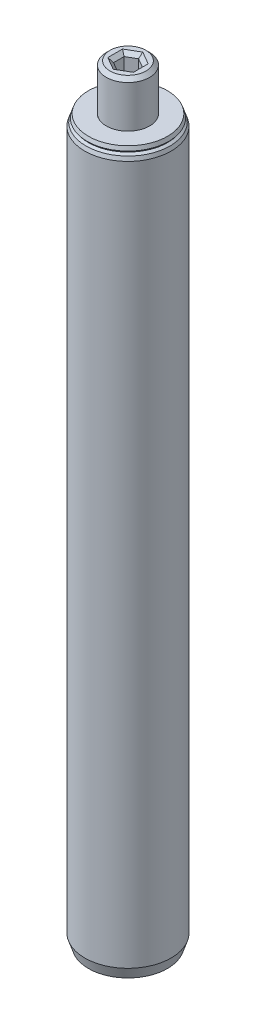
ISO-10303-21;
HEADER;
FILE_DESCRIPTION(('STEP AP214'),'2;1');
FILE_NAME('part.step','',(''),(''),'','','');
FILE_SCHEMA(('AUTOMOTIVE_DESIGN { 1 0 10303 214 1 1 1 1 }'));
ENDSEC;
DATA;
#1=APPLICATION_CONTEXT('core data for automotive mechanical design processes');
#2=APPLICATION_PROTOCOL_DEFINITION('international standard','automotive_design',2000,#1);
#3=PRODUCT_CONTEXT('',#1,'mechanical');
#4=PRODUCT('Part','Part','',(#3));
#5=PRODUCT_RELATED_PRODUCT_CATEGORY('part','',(#4));
#6=PRODUCT_DEFINITION_FORMATION('','',#4);
#7=PRODUCT_DEFINITION_CONTEXT('part definition',#1,'design');
#8=PRODUCT_DEFINITION('design','',#6,#7);
#9=PRODUCT_DEFINITION_SHAPE('','',#8);
#10=(LENGTH_UNIT() NAMED_UNIT(*) SI_UNIT(.MILLI.,.METRE.));
#11=(NAMED_UNIT(*) PLANE_ANGLE_UNIT() SI_UNIT($,.RADIAN.));
#12=(NAMED_UNIT(*) SI_UNIT($,.STERADIAN.) SOLID_ANGLE_UNIT());
#13=UNCERTAINTY_MEASURE_WITH_UNIT(LENGTH_MEASURE(1.E-05),#10,'distance_accuracy_value','');
#14=(GEOMETRIC_REPRESENTATION_CONTEXT(3) GLOBAL_UNCERTAINTY_ASSIGNED_CONTEXT((#13)) GLOBAL_UNIT_ASSIGNED_CONTEXT((#10,
#11,#12)) REPRESENTATION_CONTEXT('',''));
#15=CARTESIAN_POINT('',(0.,0.,0.));
#16=DIRECTION('',(0.,0.,1.));
#17=DIRECTION('',(1.,0.,0.));
#18=AXIS2_PLACEMENT_3D('',#15,#16,#17);
#19=CARTESIAN_POINT('',(0.,50.0126,0.));
#20=DIRECTION('',(0.,-1.,0.));
#21=DIRECTION('',(0.,0.,-1.));
#22=AXIS2_PLACEMENT_3D('',#19,#20,#21);
#23=PLANE('',#22);
#24=CARTESIAN_POINT('',(0.,50.0126,0.));
#25=DIRECTION('',(0.,-1.,0.));
#26=DIRECTION('',(0.,0.,-1.));
#27=AXIS2_PLACEMENT_3D('',#24,#25,#26);
#28=CIRCLE('',#27,1.50399999999999);
#29=CARTESIAN_POINT('',(0.,50.0126,-1.50399999999999));
#30=VERTEX_POINT('',#29);
#31=EDGE_CURVE('P0_E11',#30,#30,#28,.T.);
#32=ORIENTED_EDGE('',*,*,#31,.T.);
#33=EDGE_LOOP('',(#32));
#34=FACE_BOUND('',#33,.T.);
#35=CARTESIAN_POINT('',(0.,50.0126,0.));
#36=DIRECTION('',(0.,1.,0.));
#37=DIRECTION('',(0.,0.,1.));
#38=AXIS2_PLACEMENT_3D('',#35,#36,#37);
#39=CIRCLE('',#38,2.74319999999998);
#40=CARTESIAN_POINT('',(0.,50.0126,2.74319999999998));
#41=VERTEX_POINT('',#40);
#42=EDGE_CURVE('P0_E63',#41,#41,#39,.T.);
#43=ORIENTED_EDGE('',*,*,#42,.T.);
#44=EDGE_LOOP('',(#43));
#45=FACE_BOUND('',#44,.T.);
#46=ADVANCED_FACE('P0_F16',(#34,#45),#23,.F.);
#47=CARTESIAN_POINT('',(0.,49.7520827788524,0.));
#48=DIRECTION('',(0.,-1.,0.));
#49=DIRECTION('',(0.,0.,-1.));
#50=AXIS2_PLACEMENT_3D('',#47,#48,#49);
#51=CONICAL_SURFACE('',#50,2.83003907371584,0.321750554396634);
#52=ORIENTED_EDGE('',*,*,#42,.F.);
#53=EDGE_LOOP('',(#52));
#54=FACE_BOUND('',#53,.T.);
#55=CARTESIAN_POINT('',(0.,49.7520827788524,0.));
#56=DIRECTION('',(0.,1.,0.));
#57=DIRECTION('',(0.,0.,1.));
#58=AXIS2_PLACEMENT_3D('',#55,#56,#57);
#59=CIRCLE('',#58,2.83003907371584);
#60=CARTESIAN_POINT('',(0.,49.7520827788524,2.83003907371584));
#61=VERTEX_POINT('',#60);
#62=EDGE_CURVE('P0_E60',#61,#61,#59,.T.);
#63=ORIENTED_EDGE('',*,*,#62,.T.);
#64=EDGE_LOOP('',(#63));
#65=FACE_BOUND('',#64,.T.);
#66=ADVANCED_FACE('P0_F84',(#54,#65),#51,.T.);
#67=CARTESIAN_POINT('',(0.,49.6316,0.));
#68=DIRECTION('',(0.,1.,0.));
#69=DIRECTION('',(0.,0.,1.));
#70=AXIS2_PLACEMENT_3D('',#67,#68,#69);
#71=CONICAL_SURFACE('',#70,2.74319999999998,0.624522886199129);
#72=ORIENTED_EDGE('',*,*,#62,.F.);
#73=EDGE_LOOP('',(#72));
#74=FACE_BOUND('',#73,.T.);
#75=CARTESIAN_POINT('',(0.,49.6316,0.));
#76=DIRECTION('',(0.,1.,0.));
#77=DIRECTION('',(0.,0.,1.));
#78=AXIS2_PLACEMENT_3D('',#75,#76,#77);
#79=CIRCLE('',#78,2.74319999999998);
#80=CARTESIAN_POINT('',(0.,49.6316,2.74319999999998));
#81=VERTEX_POINT('',#80);
#82=EDGE_CURVE('P0_E57',#81,#81,#79,.T.);
#83=ORIENTED_EDGE('',*,*,#82,.T.);
#84=EDGE_LOOP('',(#83));
#85=FACE_BOUND('',#84,.T.);
#86=ADVANCED_FACE('P0_F90',(#74,#85),#71,.T.);
#87=CARTESIAN_POINT('',(0.,49.5111172211476,0.));
#88=DIRECTION('',(0.,-1.,0.));
#89=DIRECTION('',(0.,0.,-1.));
#90=AXIS2_PLACEMENT_3D('',#87,#88,#89);
#91=CONICAL_SURFACE('',#90,2.91036092628412,0.946273440595771);
#92=ORIENTED_EDGE('',*,*,#82,.F.);
#93=EDGE_LOOP('',(#92));
#94=FACE_BOUND('',#93,.T.);
#95=CARTESIAN_POINT('',(0.,49.5111172211476,0.));
#96=DIRECTION('',(0.,1.,0.));
#97=DIRECTION('',(0.,0.,1.));
#98=AXIS2_PLACEMENT_3D('',#95,#96,#97);
#99=CIRCLE('',#98,2.91036092628412);
#100=CARTESIAN_POINT('',(0.,49.5111172211476,2.91036092628412));
#101=VERTEX_POINT('',#100);
#102=EDGE_CURVE('P0_E54',#101,#101,#99,.T.);
#103=ORIENTED_EDGE('',*,*,#102,.T.);
#104=EDGE_LOOP('',(#103));
#105=FACE_BOUND('',#104,.T.);
#106=ADVANCED_FACE('P0_F97',(#94,#105),#91,.T.);
#107=CARTESIAN_POINT('',(0.,49.2506,0.));
#108=DIRECTION('',(0.,-1.,0.));
#109=DIRECTION('',(0.,0.,-1.));
#110=AXIS2_PLACEMENT_3D('',#107,#108,#109);
#111=CONICAL_SURFACE('',#110,2.99719999999998,0.321750554396655);
#112=ORIENTED_EDGE('',*,*,#102,.F.);
#113=EDGE_LOOP('',(#112));
#114=FACE_BOUND('',#113,.T.);
#115=CARTESIAN_POINT('',(0.,49.2506,0.));
#116=DIRECTION('',(0.,1.,0.));
#117=DIRECTION('',(0.,0.,1.));
#118=AXIS2_PLACEMENT_3D('',#115,#116,#117);
#119=CIRCLE('',#118,2.99719999999998);
#120=CARTESIAN_POINT('',(0.,49.2506,2.99719999999998));
#121=VERTEX_POINT('',#120);
#122=EDGE_CURVE('P0_E51',#121,#121,#119,.T.);
#123=ORIENTED_EDGE('',*,*,#122,.T.);
#124=EDGE_LOOP('',(#123));
#125=FACE_BOUND('',#124,.T.);
#126=ADVANCED_FACE('P0_F101',(#114,#125),#111,.T.);
#127=CARTESIAN_POINT('',(0.,50.0126,0.));
#128=DIRECTION('',(0.,1.,0.));
#129=DIRECTION('',(0.,0.,1.));
#130=AXIS2_PLACEMENT_3D('',#127,#128,#129);
#131=CYLINDRICAL_SURFACE('',#130,2.99719999999998);
#132=ORIENTED_EDGE('',*,*,#122,.F.);
#133=EDGE_LOOP('',(#132));
#134=FACE_BOUND('',#133,.T.);
#135=CARTESIAN_POINT('',(0.,0.761999999999999,0.));
#136=DIRECTION('',(0.,1.,0.));
#137=DIRECTION('',(0.,0.,1.));
#138=AXIS2_PLACEMENT_3D('',#135,#136,#137);
#139=CIRCLE('',#138,2.99719999999998);
#140=CARTESIAN_POINT('',(0.,0.761999999999999,2.99719999999998));
#141=VERTEX_POINT('',#140);
#142=EDGE_CURVE('P0_E48',#141,#141,#139,.T.);
#143=ORIENTED_EDGE('',*,*,#142,.T.);
#144=EDGE_LOOP('',(#143));
#145=FACE_BOUND('',#144,.T.);
#146=ADVANCED_FACE('P0_F105',(#134,#145),#131,.T.);
#147=CARTESIAN_POINT('',(0.,0.,0.));
#148=DIRECTION('',(0.,1.,0.));
#149=DIRECTION('',(0.,0.,1.));
#150=AXIS2_PLACEMENT_3D('',#147,#148,#149);
#151=CONICAL_SURFACE('',#150,2.74319999999998,0.321750554396644);
#152=ORIENTED_EDGE('',*,*,#142,.F.);
#153=EDGE_LOOP('',(#152));
#154=FACE_BOUND('',#153,.T.);
#155=CARTESIAN_POINT('',(0.,0.,0.));
#156=DIRECTION('',(0.,1.,0.));
#157=DIRECTION('',(0.,0.,1.));
#158=AXIS2_PLACEMENT_3D('',#155,#156,#157);
#159=CIRCLE('',#158,2.74319999999998);
#160=CARTESIAN_POINT('',(0.,0.,2.74319999999998));
#161=VERTEX_POINT('',#160);
#162=EDGE_CURVE('P0_E43',#161,#161,#159,.T.);
#163=ORIENTED_EDGE('',*,*,#162,.T.);
#164=EDGE_LOOP('',(#163));
#165=FACE_BOUND('',#164,.T.);
#166=ADVANCED_FACE('P0_F109',(#154,#165),#151,.T.);
#167=CARTESIAN_POINT('',(2.74319999999998,0.,0.));
#168=DIRECTION('',(0.,1.,0.));
#169=DIRECTION('',(0.,0.,1.));
#170=AXIS2_PLACEMENT_3D('',#167,#168,#169);
#171=PLANE('',#170);
#172=CARTESIAN_POINT('',(0.,0.,0.));
#173=DIRECTION('',(0.,1.,0.));
#174=DIRECTION('',(0.,0.,1.));
#175=AXIS2_PLACEMENT_3D('',#172,#173,#174);
#176=CIRCLE('',#175,1.50399999999999);
#177=CARTESIAN_POINT('',(0.,0.,1.50399999999999));
#178=VERTEX_POINT('',#177);
#179=EDGE_CURVE('P0_E69',#178,#178,#176,.T.);
#180=ORIENTED_EDGE('',*,*,#179,.T.);
#181=EDGE_LOOP('',(#180));
#182=FACE_BOUND('',#181,.T.);
#183=ORIENTED_EDGE('',*,*,#162,.F.);
#184=EDGE_LOOP('',(#183));
#185=FACE_BOUND('',#184,.T.);
#186=ADVANCED_FACE('P0_F113',(#182,#185),#171,.F.);
#187=CARTESIAN_POINT('',(0.,0.,0.));
#188=DIRECTION('',(0.,-1.,0.));
#189=DIRECTION('',(0.,0.,-1.));
#190=AXIS2_PLACEMENT_3D('',#187,#188,#189);
#191=CYLINDRICAL_SURFACE('',#190,1.25);
#192=CARTESIAN_POINT('',(0.,0.439940905122491,0.));
#193=DIRECTION('',(0.,1.,0.));
#194=DIRECTION('',(0.,0.,1.));
#195=AXIS2_PLACEMENT_3D('',#192,#193,#194);
#196=CIRCLE('',#195,1.25);
#197=CARTESIAN_POINT('',(0.,0.439940905122491,1.25));
#198=VERTEX_POINT('',#197);
#199=EDGE_CURVE('P0_E66',#198,#198,#196,.F.);
#200=ORIENTED_EDGE('',*,*,#199,.T.);
#201=EDGE_LOOP('',(#200));
#202=FACE_BOUND('',#201,.T.);
#203=CARTESIAN_POINT('',(0.,5.08,0.));
#204=DIRECTION('',(0.,-1.,0.));
#205=DIRECTION('',(0.,0.,-1.));
#206=AXIS2_PLACEMENT_3D('',#203,#204,#205);
#207=CIRCLE('',#206,1.25);
#208=CARTESIAN_POINT('',(0.,5.08,-1.25));
#209=VERTEX_POINT('',#208);
#210=EDGE_CURVE('P0_E40',#209,#209,#207,.T.);
#211=ORIENTED_EDGE('',*,*,#210,.F.);
#212=EDGE_LOOP('',(#211));
#213=FACE_BOUND('',#212,.T.);
#214=ADVANCED_FACE('P0_F117',(#202,#213),#191,.F.);
#215=CARTESIAN_POINT('',(0.,5.08,0.));
#216=DIRECTION('',(0.,-1.,0.));
#217=DIRECTION('',(0.,0.,-1.));
#218=AXIS2_PLACEMENT_3D('',#215,#216,#217);
#219=CONICAL_SURFACE('',#218,1.25,1.02974425867665);
#220=CARTESIAN_POINT('',(0.,5.83107577378445,0.));
#221=VERTEX_POINT('',#220);
#222=VERTEX_LOOP('',#221);
#223=FACE_BOUND('',#222,.T.);
#224=ORIENTED_EDGE('',*,*,#210,.T.);
#225=EDGE_LOOP('',(#224));
#226=FACE_BOUND('',#225,.T.);
#227=ADVANCED_FACE('P0_F121',(#223,#226),#219,.F.);
#228=CARTESIAN_POINT('',(0.,50.0126,0.));
#229=DIRECTION('',(0.,1.,0.));
#230=DIRECTION('',(0.,0.,1.));
#231=AXIS2_PLACEMENT_3D('',#228,#229,#230);
#232=CYLINDRICAL_SURFACE('',#231,1.25);
#233=CARTESIAN_POINT('',(0.,49.5726590948775,0.));
#234=DIRECTION('',(0.,-1.,0.));
#235=DIRECTION('',(0.,0.,-1.));
#236=AXIS2_PLACEMENT_3D('',#233,#234,#235);
#237=CIRCLE('',#236,1.25);
#238=CARTESIAN_POINT('',(0.,49.5726590948775,-1.25));
#239=VERTEX_POINT('',#238);
#240=EDGE_CURVE('P0_E24',#239,#239,#237,.F.);
#241=ORIENTED_EDGE('',*,*,#240,.T.);
#242=EDGE_LOOP('',(#241));
#243=FACE_BOUND('',#242,.T.);
#244=CARTESIAN_POINT('',(0.,44.9326,0.));
#245=DIRECTION('',(0.,1.,0.));
#246=DIRECTION('',(0.,0.,1.));
#247=AXIS2_PLACEMENT_3D('',#244,#245,#246);
#248=CIRCLE('',#247,1.25);
#249=CARTESIAN_POINT('',(0.,44.9326,1.25));
#250=VERTEX_POINT('',#249);
#251=EDGE_CURVE('P0_E38',#250,#250,#248,.T.);
#252=ORIENTED_EDGE('',*,*,#251,.F.);
#253=EDGE_LOOP('',(#252));
#254=FACE_BOUND('',#253,.T.);
#255=ADVANCED_FACE('P0_F34',(#243,#254),#232,.F.);
#256=CARTESIAN_POINT('',(0.,44.9326,0.));
#257=DIRECTION('',(0.,1.,0.));
#258=DIRECTION('',(0.,0.,1.));
#259=AXIS2_PLACEMENT_3D('',#256,#257,#258);
#260=CONICAL_SURFACE('',#259,1.25,1.02974425867665);
#261=CARTESIAN_POINT('',(0.,44.1815242262155,0.));
#262=VERTEX_POINT('',#261);
#263=VERTEX_LOOP('',#262);
#264=FACE_BOUND('',#263,.T.);
#265=ORIENTED_EDGE('',*,*,#251,.T.);
#266=EDGE_LOOP('',(#265));
#267=FACE_BOUND('',#266,.T.);
#268=ADVANCED_FACE('P0_F30',(#264,#267),#260,.F.);
#269=CARTESIAN_POINT('',(0.,0.439940905122491,0.));
#270=DIRECTION('',(0.,-1.,0.));
#271=DIRECTION('',(0.,0.,-1.));
#272=AXIS2_PLACEMENT_3D('',#269,#270,#271);
#273=CONICAL_SURFACE('',#272,1.25,0.523598775598296);
#274=ORIENTED_EDGE('',*,*,#179,.F.);
#275=EDGE_LOOP('',(#274));
#276=FACE_BOUND('',#275,.T.);
#277=ORIENTED_EDGE('',*,*,#199,.F.);
#278=EDGE_LOOP('',(#277));
#279=FACE_BOUND('',#278,.T.);
#280=ADVANCED_FACE('P0_F33',(#276,#279),#273,.F.);
#281=CARTESIAN_POINT('',(0.,49.5726590948775,0.));
#282=DIRECTION('',(0.,1.,0.));
#283=DIRECTION('',(0.,0.,1.));
#284=AXIS2_PLACEMENT_3D('',#281,#282,#283);
#285=CONICAL_SURFACE('',#284,1.25,0.523598775598296);
#286=ORIENTED_EDGE('',*,*,#31,.F.);
#287=EDGE_LOOP('',(#286));
#288=FACE_BOUND('',#287,.T.);
#289=ORIENTED_EDGE('',*,*,#240,.F.);
#290=EDGE_LOOP('',(#289));
#291=FACE_BOUND('',#290,.T.);
#292=ADVANCED_FACE('P0_F18',(#288,#291),#285,.F.);
#293=CLOSED_SHELL('',(#46,#66,#86,#106,#126,#146,#166,#186,#214,#227,#255,#268,#280,#292));
#294=MANIFOLD_SOLID_BREP('P0_B1',#293);
#295=CARTESIAN_POINT('',(-1.29903810567666,45.1876,0.749999999999999));
#296=DIRECTION('',(0.,1.,0.));
#297=DIRECTION('',(0.5,0.,0.866025403784439));
#298=AXIS2_PLACEMENT_3D('',#295,#296,#297);
#299=PLANE('',#298);
#300=CARTESIAN_POINT('',(0.,45.1876,0.));
#301=DIRECTION('',(0.,1.,0.));
#302=DIRECTION('',(0.5,0.,0.866025403784439));
#303=AXIS2_PLACEMENT_3D('',#300,#301,#302);
#304=CIRCLE('',#303,1.246);
#305=CARTESIAN_POINT('',(0.623,45.1876,1.07906765311541));
#306=VERTEX_POINT('',#305);
#307=EDGE_CURVE('P1_E125',#306,#306,#304,.F.);
#308=ORIENTED_EDGE('',*,*,#307,.T.);
#309=EDGE_LOOP('',(#308));
#310=FACE_BOUND('',#309,.T.);
#311=ADVANCED_FACE('P1_F15',(#310),#299,.F.);
#312=CARTESIAN_POINT('',(0.,53.1876,0.));
#313=DIRECTION('',(0.,-1.,0.));
#314=DIRECTION('',(-0.5,0.,-0.866025403784439));
#315=AXIS2_PLACEMENT_3D('',#312,#313,#314);
#316=PLANE('',#315);
#317=DIRECTION('',(0.866025403784439,0.,0.5));
#318=VECTOR('',#317,1.);
#319=CARTESIAN_POINT('',(0.444500000000001,53.1876,-0.769896583964367));
#320=LINE('',#319,#318);
#321=CARTESIAN_POINT('',(0.,53.1876,-1.02652877861916));
#322=VERTEX_POINT('',#321);
#323=CARTESIAN_POINT('',(0.889000000000001,53.1876,-0.513264389309577));
#324=VERTEX_POINT('',#323);
#325=EDGE_CURVE('P1_E156',#322,#324,#320,.T.);
#326=ORIENTED_EDGE('',*,*,#325,.T.);
#327=DIRECTION('',(0.,0.,1.));
#328=VECTOR('',#327,1.);
#329=CARTESIAN_POINT('',(0.889000000000001,53.1876,0.));
#330=LINE('',#329,#328);
#331=CARTESIAN_POINT('',(0.889000000000001,53.1876,0.513264389309578));
#332=VERTEX_POINT('',#331);
#333=EDGE_CURVE('P1_E158',#324,#332,#330,.T.);
#334=ORIENTED_EDGE('',*,*,#333,.T.);
#335=DIRECTION('',(-0.866025403784439,0.,0.5));
#336=VECTOR('',#335,1.);
#337=CARTESIAN_POINT('',(0.4445,53.1876,0.769896583964367));
#338=LINE('',#337,#336);
#339=CARTESIAN_POINT('',(0.,53.1876,1.02652877861916));
#340=VERTEX_POINT('',#339);
#341=EDGE_CURVE('P1_E148',#332,#340,#338,.T.);
#342=ORIENTED_EDGE('',*,*,#341,.T.);
#343=DIRECTION('',(-0.866025403784439,0.,-0.5));
#344=VECTOR('',#343,1.);
#345=CARTESIAN_POINT('',(-0.444500000000001,53.1876,0.769896583964367));
#346=LINE('',#345,#344);
#347=CARTESIAN_POINT('',(-0.889000000000001,53.1876,0.513264389309578));
#348=VERTEX_POINT('',#347);
#349=EDGE_CURVE('P1_E150',#340,#348,#346,.T.);
#350=ORIENTED_EDGE('',*,*,#349,.T.);
#351=DIRECTION('',(0.,0.,-1.));
#352=VECTOR('',#351,1.);
#353=CARTESIAN_POINT('',(-0.889000000000001,53.1876,0.));
#354=LINE('',#353,#352);
#355=CARTESIAN_POINT('',(-0.889000000000001,53.1876,-0.513264389309578));
#356=VERTEX_POINT('',#355);
#357=EDGE_CURVE('P1_E152',#348,#356,#354,.T.);
#358=ORIENTED_EDGE('',*,*,#357,.T.);
#359=DIRECTION('',(0.866025403784439,0.,-0.499999999999999));
#360=VECTOR('',#359,1.);
#361=CARTESIAN_POINT('',(-0.4445,53.1876,-0.769896583964367));
#362=LINE('',#361,#360);
#363=EDGE_CURVE('P1_E154',#356,#322,#362,.T.);
#364=ORIENTED_EDGE('',*,*,#363,.T.);
#365=EDGE_LOOP('',(#326,#334,#342,#350,#358,#364));
#366=FACE_BOUND('',#365,.T.);
#367=CARTESIAN_POINT('',(0.,53.1876,0.));
#368=DIRECTION('',(0.,-1.,0.));
#369=DIRECTION('',(-0.5,0.,-0.866025403784439));
#370=AXIS2_PLACEMENT_3D('',#367,#368,#369);
#371=CIRCLE('',#370,1.246);
#372=CARTESIAN_POINT('',(-0.623,53.1876,-1.07906765311541));
#373=VERTEX_POINT('',#372);
#374=EDGE_CURVE('P1_E142',#373,#373,#371,.F.);
#375=ORIENTED_EDGE('',*,*,#374,.T.);
#376=EDGE_LOOP('',(#375));
#377=FACE_BOUND('',#376,.T.);
#378=ADVANCED_FACE('P1_F207',(#366,#377),#316,.F.);
#379=CARTESIAN_POINT('',(0.,45.1876,0.));
#380=DIRECTION('',(0.,-1.,0.));
#381=DIRECTION('',(-0.5,0.,-0.866025403784439));
#382=AXIS2_PLACEMENT_3D('',#379,#380,#381);
#383=CYLINDRICAL_SURFACE('',#382,1.5);
#384=CARTESIAN_POINT('',(0.,45.4416,0.));
#385=DIRECTION('',(0.,1.,0.));
#386=DIRECTION('',(0.5,0.,0.866025403784439));
#387=AXIS2_PLACEMENT_3D('',#384,#385,#386);
#388=CIRCLE('',#387,1.5);
#389=CARTESIAN_POINT('',(0.749999999999999,45.4416,1.29903810567666));
#390=VERTEX_POINT('',#389);
#391=EDGE_CURVE('P1_E139',#390,#390,#388,.T.);
#392=ORIENTED_EDGE('',*,*,#391,.T.);
#393=EDGE_LOOP('',(#392));
#394=FACE_BOUND('',#393,.T.);
#395=CARTESIAN_POINT('',(0.,52.9336,0.));
#396=DIRECTION('',(0.,-1.,0.));
#397=DIRECTION('',(-0.5,0.,-0.866025403784439));
#398=AXIS2_PLACEMENT_3D('',#395,#396,#397);
#399=CIRCLE('',#398,1.5);
#400=CARTESIAN_POINT('',(-0.749999999999999,52.9336,-1.29903810567666));
#401=VERTEX_POINT('',#400);
#402=EDGE_CURVE('P1_E136',#401,#401,#399,.T.);
#403=ORIENTED_EDGE('',*,*,#402,.T.);
#404=EDGE_LOOP('',(#403));
#405=FACE_BOUND('',#404,.T.);
#406=ADVANCED_FACE('P1_F210',(#394,#405),#383,.T.);
#407=CARTESIAN_POINT('',(0.,45.1876,0.));
#408=DIRECTION('',(0.,1.,0.));
#409=DIRECTION('',(0.5,0.,0.866025403784439));
#410=AXIS2_PLACEMENT_3D('',#407,#408,#409);
#411=CONICAL_SURFACE('',#410,1.246,0.785398163397446);
#412=ORIENTED_EDGE('',*,*,#391,.F.);
#413=EDGE_LOOP('',(#412));
#414=FACE_BOUND('',#413,.T.);
#415=ORIENTED_EDGE('',*,*,#307,.F.);
#416=EDGE_LOOP('',(#415));
#417=FACE_BOUND('',#416,.T.);
#418=ADVANCED_FACE('P1_F217',(#414,#417),#411,.T.);
#419=CARTESIAN_POINT('',(0.,52.9336,0.));
#420=DIRECTION('',(0.,-1.,0.));
#421=DIRECTION('',(-0.5,0.,-0.866025403784439));
#422=AXIS2_PLACEMENT_3D('',#419,#420,#421);
#423=CONICAL_SURFACE('',#422,1.5,0.785398163397447);
#424=ORIENTED_EDGE('',*,*,#374,.F.);
#425=EDGE_LOOP('',(#424));
#426=FACE_BOUND('',#425,.T.);
#427=ORIENTED_EDGE('',*,*,#402,.F.);
#428=EDGE_LOOP('',(#427));
#429=FACE_BOUND('',#428,.T.);
#430=ADVANCED_FACE('P1_F214',(#426,#429),#423,.T.);
#431=CARTESIAN_POINT('',(0.635,51.9176,-0.366617420935412));
#432=DIRECTION('',(0.5,0.,-0.866025403784438));
#433=DIRECTION('',(-0.866025403784439,0.,-0.5));
#434=AXIS2_PLACEMENT_3D('',#431,#432,#433);
#435=PLANE('',#434);
#436=DIRECTION('',(0.,1.,0.));
#437=VECTOR('',#436,1.);
#438=CARTESIAN_POINT('',(0.635,51.9176,-0.366617420935412));
#439=LINE('',#438,#437);
#440=CARTESIAN_POINT('',(0.635,51.9176,-0.366617420935412));
#441=VERTEX_POINT('',#440);
#442=CARTESIAN_POINT('',(0.635,52.9336,-0.366617420935412));
#443=VERTEX_POINT('',#442);
#444=EDGE_CURVE('P1_E123',#441,#443,#439,.T.);
#445=ORIENTED_EDGE('',*,*,#444,.T.);
#446=DIRECTION('',(-0.866025403784439,0.,-0.5));
#447=VECTOR('',#446,1.);
#448=CARTESIAN_POINT('',(0.635,52.9336,-0.366617420935412));
#449=LINE('',#448,#447);
#450=CARTESIAN_POINT('',(0.,52.9336,-0.733234841870825));
#451=VERTEX_POINT('',#450);
#452=EDGE_CURVE('P1_E95',#443,#451,#449,.T.);
#453=ORIENTED_EDGE('',*,*,#452,.T.);
#454=DIRECTION('',(0.,1.,0.));
#455=VECTOR('',#454,1.);
#456=CARTESIAN_POINT('',(0.,51.9176,-0.733234841870825));
#457=LINE('',#456,#455);
#458=CARTESIAN_POINT('',(0.,51.9176,-0.733234841870825));
#459=VERTEX_POINT('',#458);
#460=EDGE_CURVE('P1_E87',#459,#451,#457,.T.);
#461=ORIENTED_EDGE('',*,*,#460,.F.);
#462=DIRECTION('',(-0.866025403784439,0.,-0.5));
#463=VECTOR('',#462,1.);
#464=CARTESIAN_POINT('',(0.635,51.9176,-0.366617420935412));
#465=LINE('',#464,#463);
#466=EDGE_CURVE('P1_E92',#441,#459,#465,.T.);
#467=ORIENTED_EDGE('',*,*,#466,.F.);
#468=EDGE_LOOP('',(#445,#453,#461,#467));
#469=FACE_BOUND('',#468,.T.);
#470=ADVANCED_FACE('P1_F90',(#469),#435,.F.);
#471=CARTESIAN_POINT('',(0.635,51.9176,0.366617420935413));
#472=DIRECTION('',(1.,0.,0.));
#473=DIRECTION('',(0.,0.,-1.));
#474=AXIS2_PLACEMENT_3D('',#471,#472,#473);
#475=PLANE('',#474);
#476=DIRECTION('',(0.,1.,0.));
#477=VECTOR('',#476,1.);
#478=CARTESIAN_POINT('',(0.635,51.9176,0.366617420935413));
#479=LINE('',#478,#477);
#480=CARTESIAN_POINT('',(0.635,51.9176,0.366617420935413));
#481=VERTEX_POINT('',#480);
#482=CARTESIAN_POINT('',(0.635,52.9336,0.366617420935413));
#483=VERTEX_POINT('',#482);
#484=EDGE_CURVE('P1_E126',#481,#483,#479,.T.);
#485=ORIENTED_EDGE('',*,*,#484,.T.);
#486=DIRECTION('',(0.,0.,-1.));
#487=VECTOR('',#486,1.);
#488=CARTESIAN_POINT('',(0.635,52.9336,0.366617420935413));
#489=LINE('',#488,#487);
#490=EDGE_CURVE('P1_E145',#483,#443,#489,.T.);
#491=ORIENTED_EDGE('',*,*,#490,.T.);
#492=ORIENTED_EDGE('',*,*,#444,.F.);
#493=DIRECTION('',(0.,0.,-1.));
#494=VECTOR('',#493,1.);
#495=CARTESIAN_POINT('',(0.635,51.9176,0.366617420935413));
#496=LINE('',#495,#494);
#497=EDGE_CURVE('P1_E99',#481,#441,#496,.T.);
#498=ORIENTED_EDGE('',*,*,#497,.F.);
#499=EDGE_LOOP('',(#485,#491,#492,#498));
#500=FACE_BOUND('',#499,.T.);
#501=ADVANCED_FACE('P1_F198',(#500),#475,.F.);
#502=CARTESIAN_POINT('',(0.,51.9176,0.733234841870825));
#503=DIRECTION('',(0.5,0.,0.866025403784439));
#504=DIRECTION('',(0.866025403784439,0.,-0.5));
#505=AXIS2_PLACEMENT_3D('',#502,#503,#504);
#506=PLANE('',#505);
#507=DIRECTION('',(0.,1.,0.));
#508=VECTOR('',#507,1.);
#509=CARTESIAN_POINT('',(0.,51.9176,0.733234841870825));
#510=LINE('',#509,#508);
#511=CARTESIAN_POINT('',(0.,51.9176,0.733234841870825));
#512=VERTEX_POINT('',#511);
#513=CARTESIAN_POINT('',(0.,52.9336,0.733234841870825));
#514=VERTEX_POINT('',#513);
#515=EDGE_CURVE('P1_E129',#512,#514,#510,.T.);
#516=ORIENTED_EDGE('',*,*,#515,.T.);
#517=DIRECTION('',(0.866025403784439,0.,-0.5));
#518=VECTOR('',#517,1.);
#519=CARTESIAN_POINT('',(0.,52.9336,0.733234841870825));
#520=LINE('',#519,#518);
#521=EDGE_CURVE('P1_E10',#514,#483,#520,.T.);
#522=ORIENTED_EDGE('',*,*,#521,.T.);
#523=ORIENTED_EDGE('',*,*,#484,.F.);
#524=DIRECTION('',(0.866025403784439,0.,-0.5));
#525=VECTOR('',#524,1.);
#526=CARTESIAN_POINT('',(0.,51.9176,0.733234841870825));
#527=LINE('',#526,#525);
#528=EDGE_CURVE('P1_E120',#512,#481,#527,.T.);
#529=ORIENTED_EDGE('',*,*,#528,.F.);
#530=EDGE_LOOP('',(#516,#522,#523,#529));
#531=FACE_BOUND('',#530,.T.);
#532=ADVANCED_FACE('P1_F195',(#531),#506,.F.);
#533=CARTESIAN_POINT('',(-0.635,51.9176,0.366617420935412));
#534=DIRECTION('',(-0.5,0.,0.866025403784438));
#535=DIRECTION('',(0.866025403784438,0.,0.5));
#536=AXIS2_PLACEMENT_3D('',#533,#534,#535);
#537=PLANE('',#536);
#538=DIRECTION('',(0.,1.,0.));
#539=VECTOR('',#538,1.);
#540=CARTESIAN_POINT('',(-0.635,51.9176,0.366617420935412));
#541=LINE('',#540,#539);
#542=CARTESIAN_POINT('',(-0.635,51.9176,0.366617420935412));
#543=VERTEX_POINT('',#542);
#544=CARTESIAN_POINT('',(-0.635,52.9336,0.366617420935412));
#545=VERTEX_POINT('',#544);
#546=EDGE_CURVE('P1_E131',#543,#545,#541,.T.);
#547=ORIENTED_EDGE('',*,*,#546,.T.);
#548=DIRECTION('',(0.866025403784438,0.,0.5));
#549=VECTOR('',#548,1.);
#550=CARTESIAN_POINT('',(-0.635,52.9336,0.366617420935412));
#551=LINE('',#550,#549);
#552=EDGE_CURVE('P1_E24',#545,#514,#551,.T.);
#553=ORIENTED_EDGE('',*,*,#552,.T.);
#554=ORIENTED_EDGE('',*,*,#515,.F.);
#555=DIRECTION('',(0.866025403784439,0.,0.5));
#556=VECTOR('',#555,1.);
#557=CARTESIAN_POINT('',(-0.635,51.9176,0.366617420935412));
#558=LINE('',#557,#556);
#559=EDGE_CURVE('P1_E117',#543,#512,#558,.T.);
#560=ORIENTED_EDGE('',*,*,#559,.F.);
#561=EDGE_LOOP('',(#547,#553,#554,#560));
#562=FACE_BOUND('',#561,.T.);
#563=ADVANCED_FACE('P1_F262',(#562),#537,.F.);
#564=CARTESIAN_POINT('',(-0.635,51.9176,-0.366617420935413));
#565=DIRECTION('',(-1.,0.,0.));
#566=DIRECTION('',(0.,0.,1.));
#567=AXIS2_PLACEMENT_3D('',#564,#565,#566);
#568=PLANE('',#567);
#569=DIRECTION('',(0.,1.,0.));
#570=VECTOR('',#569,1.);
#571=CARTESIAN_POINT('',(-0.635,51.9176,-0.366617420935413));
#572=LINE('',#571,#570);
#573=CARTESIAN_POINT('',(-0.635,51.9176,-0.366617420935413));
#574=VERTEX_POINT('',#573);
#575=CARTESIAN_POINT('',(-0.635,52.9336,-0.366617420935413));
#576=VERTEX_POINT('',#575);
#577=EDGE_CURVE('P1_E98',#574,#576,#572,.T.);
#578=ORIENTED_EDGE('',*,*,#577,.T.);
#579=DIRECTION('',(0.,0.,1.));
#580=VECTOR('',#579,1.);
#581=CARTESIAN_POINT('',(-0.635,52.9336,-0.366617420935413));
#582=LINE('',#581,#580);
#583=EDGE_CURVE('P1_E39',#576,#545,#582,.T.);
#584=ORIENTED_EDGE('',*,*,#583,.T.);
#585=ORIENTED_EDGE('',*,*,#546,.F.);
#586=DIRECTION('',(0.,0.,1.));
#587=VECTOR('',#586,1.);
#588=CARTESIAN_POINT('',(-0.635,51.9176,-0.366617420935413));
#589=LINE('',#588,#587);
#590=EDGE_CURVE('P1_E107',#574,#543,#589,.T.);
#591=ORIENTED_EDGE('',*,*,#590,.F.);
#592=EDGE_LOOP('',(#578,#584,#585,#591));
#593=FACE_BOUND('',#592,.T.);
#594=ADVANCED_FACE('P1_F255',(#593),#568,.F.);
#595=CARTESIAN_POINT('',(0.,51.9176,-0.733234841870825));
#596=DIRECTION('',(-0.499999999999999,0.,-0.866025403784439));
#597=DIRECTION('',(-0.866025403784439,0.,0.499999999999999));
#598=AXIS2_PLACEMENT_3D('',#595,#596,#597);
#599=PLANE('',#598);
#600=ORIENTED_EDGE('',*,*,#460,.T.);
#601=DIRECTION('',(-0.866025403784439,0.,0.499999999999999));
#602=VECTOR('',#601,1.);
#603=CARTESIAN_POINT('',(0.,52.9336,-0.733234841870825));
#604=LINE('',#603,#602);
#605=EDGE_CURVE('P1_E162',#451,#576,#604,.T.);
#606=ORIENTED_EDGE('',*,*,#605,.T.);
#607=ORIENTED_EDGE('',*,*,#577,.F.);
#608=DIRECTION('',(-0.866025403784439,0.,0.499999999999999));
#609=VECTOR('',#608,1.);
#610=CARTESIAN_POINT('',(0.,51.9176,-0.733234841870825));
#611=LINE('',#610,#609);
#612=EDGE_CURVE('P1_E102',#459,#574,#611,.T.);
#613=ORIENTED_EDGE('',*,*,#612,.F.);
#614=EDGE_LOOP('',(#600,#606,#607,#613));
#615=FACE_BOUND('',#614,.T.);
#616=ADVANCED_FACE('P1_F103',(#615),#599,.F.);
#617=CARTESIAN_POINT('',(1.27,51.9176,0.));
#618=DIRECTION('',(0.,-1.,0.));
#619=DIRECTION('',(-0.5,0.,-0.866025403784439));
#620=AXIS2_PLACEMENT_3D('',#617,#618,#619);
#621=PLANE('',#620);
#622=ORIENTED_EDGE('',*,*,#466,.T.);
#623=ORIENTED_EDGE('',*,*,#612,.T.);
#624=ORIENTED_EDGE('',*,*,#590,.T.);
#625=ORIENTED_EDGE('',*,*,#559,.T.);
#626=ORIENTED_EDGE('',*,*,#528,.T.);
#627=ORIENTED_EDGE('',*,*,#497,.T.);
#628=EDGE_LOOP('',(#622,#623,#624,#625,#626,#627));
#629=FACE_BOUND('',#628,.T.);
#630=ADVANCED_FACE('P1_F109',(#629),#621,.F.);
#631=CARTESIAN_POINT('',(-0.635,52.9336,-0.366617420935413));
#632=DIRECTION('',(-0.707106781186546,-0.707106781186549,0.));
#633=DIRECTION('',(0.654653670707978,-0.654653670707976,-0.377964473009228));
#634=AXIS2_PLACEMENT_3D('',#631,#632,#633);
#635=PLANE('',#634);
#636=DIRECTION('',(-0.654653670707978,0.654653670707976,-0.377964473009228));
#637=VECTOR('',#636,1.);
#638=CARTESIAN_POINT('',(-0.453571428571428,52.7521714285714,-0.261869586382437));
#639=LINE('',#638,#637);
#640=EDGE_CURVE('P1_E114',#356,#576,#639,.F.);
#641=ORIENTED_EDGE('',*,*,#640,.F.);
#642=ORIENTED_EDGE('',*,*,#357,.F.);
#643=DIRECTION('',(-0.654653670707979,0.654653670707976,0.377964473009227));
#644=VECTOR('',#643,1.);
#645=CARTESIAN_POINT('',(-0.453571428571428,52.7521714285714,0.261869586382437));
#646=LINE('',#645,#644);
#647=EDGE_CURVE('P1_E19',#545,#348,#646,.T.);
#648=ORIENTED_EDGE('',*,*,#647,.F.);
#649=ORIENTED_EDGE('',*,*,#583,.F.);
#650=EDGE_LOOP('',(#641,#642,#648,#649));
#651=FACE_BOUND('',#650,.T.);
#652=ADVANCED_FACE('P1_F17',(#651),#635,.F.);
#653=CARTESIAN_POINT('',(-0.635,52.9336,0.366617420935412));
#654=DIRECTION('',(-0.353553390593273,-0.707106781186549,0.612372435695793));
#655=DIRECTION('',(0.654653670707978,-0.654653670707976,-0.377964473009227));
#656=AXIS2_PLACEMENT_3D('',#653,#654,#655);
#657=PLANE('',#656);
#658=ORIENTED_EDGE('',*,*,#647,.T.);
#659=ORIENTED_EDGE('',*,*,#349,.F.);
#660=DIRECTION('',(0.,0.654653670707976,0.755928946018456));
#661=VECTOR('',#660,1.);
#662=CARTESIAN_POINT('',(0.,52.7521714285714,0.523739172764874));
#663=LINE('',#662,#661);
#664=EDGE_CURVE('P1_E173',#514,#340,#663,.T.);
#665=ORIENTED_EDGE('',*,*,#664,.F.);
#666=ORIENTED_EDGE('',*,*,#552,.F.);
#667=EDGE_LOOP('',(#658,#659,#665,#666));
#668=FACE_BOUND('',#667,.T.);
#669=ADVANCED_FACE('P1_F187',(#668),#657,.F.);
#670=CARTESIAN_POINT('',(0.,52.9336,-0.733234841870825));
#671=DIRECTION('',(-0.353553390593273,-0.707106781186549,-0.612372435695793));
#672=DIRECTION('',(-0.353553390593274,0.707106781186546,-0.612372435695796));
#673=AXIS2_PLACEMENT_3D('',#670,#671,#672);
#674=PLANE('',#673);
#675=ORIENTED_EDGE('',*,*,#640,.T.);
#676=ORIENTED_EDGE('',*,*,#605,.F.);
#677=DIRECTION('',(0.,0.654653670707976,-0.755928946018456));
#678=VECTOR('',#677,1.);
#679=CARTESIAN_POINT('',(0.,52.7521714285714,-0.523739172764874));
#680=LINE('',#679,#678);
#681=EDGE_CURVE('P1_E170',#322,#451,#680,.F.);
#682=ORIENTED_EDGE('',*,*,#681,.F.);
#683=ORIENTED_EDGE('',*,*,#363,.F.);
#684=EDGE_LOOP('',(#675,#676,#682,#683));
#685=FACE_BOUND('',#684,.T.);
#686=ADVANCED_FACE('P1_F179',(#685),#674,.F.);
#687=CARTESIAN_POINT('',(0.,52.9336,0.733234841870825));
#688=DIRECTION('',(0.353553390593273,-0.707106781186549,0.612372435695794));
#689=DIRECTION('',(-0.353553390593274,-0.707106781186546,-0.612372435695796));
#690=AXIS2_PLACEMENT_3D('',#687,#688,#689);
#691=PLANE('',#690);
#692=ORIENTED_EDGE('',*,*,#664,.T.);
#693=ORIENTED_EDGE('',*,*,#341,.F.);
#694=DIRECTION('',(-0.654653670707978,-0.654653670707976,-0.377964473009228));
#695=VECTOR('',#694,1.);
#696=CARTESIAN_POINT('',(0.635,52.9336,0.366617420935413));
#697=LINE('',#696,#695);
#698=EDGE_CURVE('P1_E168',#483,#332,#697,.F.);
#699=ORIENTED_EDGE('',*,*,#698,.F.);
#700=ORIENTED_EDGE('',*,*,#521,.F.);
#701=EDGE_LOOP('',(#692,#693,#699,#700));
#702=FACE_BOUND('',#701,.T.);
#703=ADVANCED_FACE('P1_F192',(#702),#691,.F.);
#704=CARTESIAN_POINT('',(0.635,52.9336,-0.366617420935412));
#705=DIRECTION('',(0.353553390593273,-0.707106781186549,-0.612372435695793));
#706=DIRECTION('',(0.654653670707978,0.654653670707976,-0.377964473009227));
#707=AXIS2_PLACEMENT_3D('',#704,#705,#706);
#708=PLANE('',#707);
#709=ORIENTED_EDGE('',*,*,#681,.T.);
#710=ORIENTED_EDGE('',*,*,#452,.F.);
#711=DIRECTION('',(0.654653670707979,0.654653670707976,-0.377964473009227));
#712=VECTOR('',#711,1.);
#713=CARTESIAN_POINT('',(0.453571428571428,52.7521714285714,-0.261869586382437));
#714=LINE('',#713,#712);
#715=EDGE_CURVE('P1_E166',#324,#443,#714,.F.);
#716=ORIENTED_EDGE('',*,*,#715,.F.);
#717=ORIENTED_EDGE('',*,*,#325,.F.);
#718=EDGE_LOOP('',(#709,#710,#716,#717));
#719=FACE_BOUND('',#718,.T.);
#720=ADVANCED_FACE('P1_F205',(#719),#708,.F.);
#721=CARTESIAN_POINT('',(0.635,52.9336,0.366617420935413));
#722=DIRECTION('',(0.707106781186546,-0.707106781186549,0.));
#723=DIRECTION('',(0.654653670707978,0.654653670707976,-0.377964473009228));
#724=AXIS2_PLACEMENT_3D('',#721,#722,#723);
#725=PLANE('',#724);
#726=ORIENTED_EDGE('',*,*,#698,.T.);
#727=ORIENTED_EDGE('',*,*,#333,.F.);
#728=ORIENTED_EDGE('',*,*,#715,.T.);
#729=ORIENTED_EDGE('',*,*,#490,.F.);
#730=EDGE_LOOP('',(#726,#727,#728,#729));
#731=FACE_BOUND('',#730,.T.);
#732=ADVANCED_FACE('P1_F200',(#731),#725,.F.);
#733=CLOSED_SHELL('',(#311,#378,#406,#418,#430,#470,#501,#532,#563,#594,#616,#630,#652,#669,
#686,#703,#720,#732));
#734=MANIFOLD_SOLID_BREP('P1_B1',#733);
#735=ADVANCED_BREP_SHAPE_REPRESENTATION('',(#18,#294,#734),#14);
#736=SHAPE_DEFINITION_REPRESENTATION(#9,#735);
ENDSEC;
END-ISO-10303-21;
